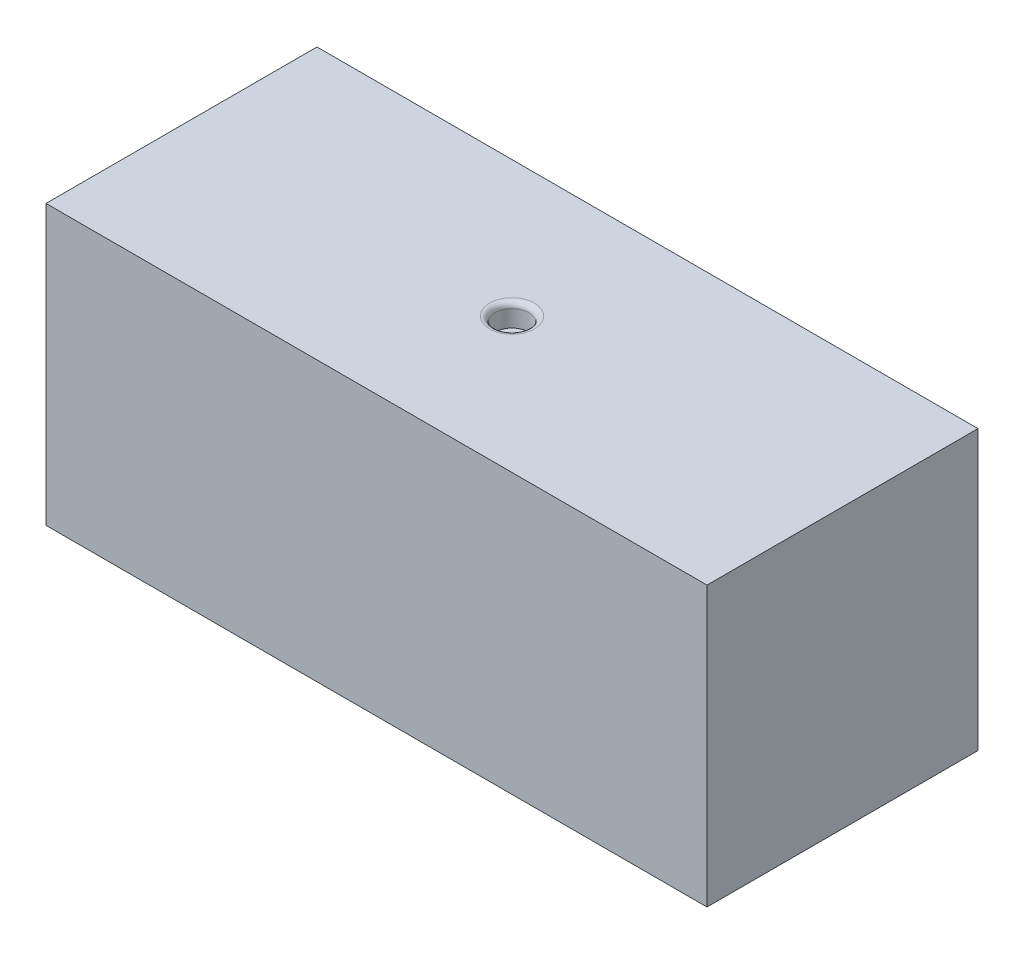
ISO-10303-21;
HEADER;
FILE_DESCRIPTION(('STEP AP214'),'2;1');
FILE_NAME('part.step','',(''),(''),'','','');
FILE_SCHEMA(('AUTOMOTIVE_DESIGN { 1 0 10303 214 1 1 1 1 }'));
ENDSEC;
DATA;
#1=APPLICATION_CONTEXT('core data for automotive mechanical design processes');
#2=APPLICATION_PROTOCOL_DEFINITION('international standard','automotive_design',2000,#1);
#3=PRODUCT_CONTEXT('',#1,'mechanical');
#4=PRODUCT('Part','Part','',(#3));
#5=PRODUCT_RELATED_PRODUCT_CATEGORY('part','',(#4));
#6=PRODUCT_DEFINITION_FORMATION('','',#4);
#7=PRODUCT_DEFINITION_CONTEXT('part definition',#1,'design');
#8=PRODUCT_DEFINITION('design','',#6,#7);
#9=PRODUCT_DEFINITION_SHAPE('','',#8);
#10=(LENGTH_UNIT() NAMED_UNIT(*) SI_UNIT(.MILLI.,.METRE.));
#11=(NAMED_UNIT(*) PLANE_ANGLE_UNIT() SI_UNIT($,.RADIAN.));
#12=(NAMED_UNIT(*) SI_UNIT($,.STERADIAN.) SOLID_ANGLE_UNIT());
#13=UNCERTAINTY_MEASURE_WITH_UNIT(LENGTH_MEASURE(1.E-05),#10,'distance_accuracy_value','');
#14=(GEOMETRIC_REPRESENTATION_CONTEXT(3) GLOBAL_UNCERTAINTY_ASSIGNED_CONTEXT((#13)) GLOBAL_UNIT_ASSIGNED_CONTEXT((#10,
#11,#12)) REPRESENTATION_CONTEXT('',''));
#15=CARTESIAN_POINT('',(0.,0.,0.));
#16=DIRECTION('',(0.,0.,1.));
#17=DIRECTION('',(1.,0.,0.));
#18=AXIS2_PLACEMENT_3D('',#15,#16,#17);
#19=CARTESIAN_POINT('',(0.,52.,0.));
#20=DIRECTION('',(0.,1.,0.));
#21=DIRECTION('',(0.,0.,1.));
#22=AXIS2_PLACEMENT_3D('',#19,#20,#21);
#23=PLANE('',#22);
#24=DIRECTION('',(0.,0.,-1.));
#25=VECTOR('',#24,1.);
#26=CARTESIAN_POINT('',(-87.65,52.,35.195));
#27=LINE('',#26,#25);
#28=CARTESIAN_POINT('',(-87.65,52.,35.195));
#29=VERTEX_POINT('',#28);
#30=CARTESIAN_POINT('',(-87.65,52.,-35.195));
#31=VERTEX_POINT('',#30);
#32=EDGE_CURVE('E367',#29,#31,#27,.T.);
#33=ORIENTED_EDGE('',*,*,#32,.F.);
#34=DIRECTION('',(-1.,0.,0.));
#35=VECTOR('',#34,1.);
#36=CARTESIAN_POINT('',(87.6499999999999,52.,35.195));
#37=LINE('',#36,#35);
#38=CARTESIAN_POINT('',(87.6499999999999,52.,35.195));
#39=VERTEX_POINT('',#38);
#40=EDGE_CURVE('E51',#39,#29,#37,.T.);
#41=ORIENTED_EDGE('',*,*,#40,.F.);
#42=DIRECTION('',(0.,0.,1.));
#43=VECTOR('',#42,1.);
#44=CARTESIAN_POINT('',(87.6499999999999,52.,-35.195));
#45=LINE('',#44,#43);
#46=CARTESIAN_POINT('',(87.6499999999999,52.,-35.195));
#47=VERTEX_POINT('',#46);
#48=EDGE_CURVE('E360',#47,#39,#45,.T.);
#49=ORIENTED_EDGE('',*,*,#48,.F.);
#50=DIRECTION('',(1.,0.,0.));
#51=VECTOR('',#50,1.);
#52=CARTESIAN_POINT('',(-87.65,52.,-35.195));
#53=LINE('',#52,#51);
#54=EDGE_CURVE('E364',#31,#47,#53,.T.);
#55=ORIENTED_EDGE('',*,*,#54,.F.);
#56=EDGE_LOOP('',(#33,#41,#49,#55));
#57=FACE_BOUND('',#56,.T.);
#58=DIRECTION('',(0.,0.,1.));
#59=VECTOR('',#58,1.);
#60=CARTESIAN_POINT('',(-88.9,52.,36.445));
#61=LINE('',#60,#59);
#62=CARTESIAN_POINT('',(-88.9,52.,-36.445));
#63=VERTEX_POINT('',#62);
#64=CARTESIAN_POINT('',(-88.9,52.,36.445));
#65=VERTEX_POINT('',#64);
#66=EDGE_CURVE('E173',#63,#65,#61,.T.);
#67=ORIENTED_EDGE('',*,*,#66,.F.);
#68=DIRECTION('',(1.,0.,0.));
#69=VECTOR('',#68,1.);
#70=CARTESIAN_POINT('',(0.,52.,-36.445));
#71=LINE('',#70,#69);
#72=CARTESIAN_POINT('',(88.8999999999999,52.,-36.445));
#73=VERTEX_POINT('',#72);
#74=EDGE_CURVE('E195',#63,#73,#71,.T.);
#75=ORIENTED_EDGE('',*,*,#74,.T.);
#76=DIRECTION('',(0.,0.,-1.));
#77=VECTOR('',#76,1.);
#78=CARTESIAN_POINT('',(88.8999999999999,52.,36.445));
#79=LINE('',#78,#77);
#80=CARTESIAN_POINT('',(88.8999999999999,52.,36.445));
#81=VERTEX_POINT('',#80);
#82=EDGE_CURVE('E198',#81,#73,#79,.T.);
#83=ORIENTED_EDGE('',*,*,#82,.F.);
#84=DIRECTION('',(1.,0.,0.));
#85=VECTOR('',#84,1.);
#86=CARTESIAN_POINT('',(0.,52.,36.445));
#87=LINE('',#86,#85);
#88=EDGE_CURVE('E170',#65,#81,#87,.T.);
#89=ORIENTED_EDGE('',*,*,#88,.F.);
#90=EDGE_LOOP('',(#67,#75,#83,#89));
#91=FACE_BOUND('',#90,.T.);
#92=ADVANCED_FACE('F36',(#57,#91),#23,.F.);
#93=CARTESIAN_POINT('',(88.8999999999999,-127.,36.445));
#94=DIRECTION('',(-1.,0.,0.));
#95=DIRECTION('',(0.,0.,1.));
#96=AXIS2_PLACEMENT_3D('',#93,#94,#95);
#97=PLANE('',#96);
#98=DIRECTION('',(0.,1.,0.));
#99=VECTOR('',#98,1.);
#100=CARTESIAN_POINT('',(88.8999999999999,-127.,36.445));
#101=LINE('',#100,#99);
#102=CARTESIAN_POINT('',(88.8999999999999,127.,36.445));
#103=VERTEX_POINT('',#102);
#104=EDGE_CURVE('E308',#81,#103,#101,.T.);
#105=ORIENTED_EDGE('',*,*,#104,.F.);
#106=ORIENTED_EDGE('',*,*,#82,.T.);
#107=DIRECTION('',(0.,1.,0.));
#108=VECTOR('',#107,1.);
#109=CARTESIAN_POINT('',(88.8999999999999,-127.,-36.445));
#110=LINE('',#109,#108);
#111=CARTESIAN_POINT('',(88.8999999999999,127.,-36.445));
#112=VERTEX_POINT('',#111);
#113=EDGE_CURVE('E302',#73,#112,#110,.T.);
#114=ORIENTED_EDGE('',*,*,#113,.T.);
#115=DIRECTION('',(0.,0.,-1.));
#116=VECTOR('',#115,1.);
#117=CARTESIAN_POINT('',(88.8999999999999,127.,36.445));
#118=LINE('',#117,#116);
#119=EDGE_CURVE('E179',#103,#112,#118,.T.);
#120=ORIENTED_EDGE('',*,*,#119,.F.);
#121=EDGE_LOOP('',(#105,#106,#114,#120));
#122=FACE_BOUND('',#121,.T.);
#123=ADVANCED_FACE('F216',(#122),#97,.F.);
#124=CARTESIAN_POINT('',(-88.9,127.,36.445));
#125=DIRECTION('',(0.,-1.,0.));
#126=DIRECTION('',(0.,0.,-1.));
#127=AXIS2_PLACEMENT_3D('',#124,#125,#126);
#128=PLANE('',#127);
#129=CARTESIAN_POINT('',(0.,127.,0.));
#130=DIRECTION('',(0.,-1.,0.));
#131=DIRECTION('',(0.,0.,-1.));
#132=AXIS2_PLACEMENT_3D('',#129,#130,#131);
#133=CIRCLE('',#132,6.025);
#134=CARTESIAN_POINT('',(0.,127.,-6.025));
#135=VERTEX_POINT('',#134);
#136=EDGE_CURVE('E12',#135,#135,#133,.T.);
#137=ORIENTED_EDGE('',*,*,#136,.T.);
#138=EDGE_LOOP('',(#137));
#139=FACE_BOUND('',#138,.T.);
#140=DIRECTION('',(-1.,0.,0.));
#141=VECTOR('',#140,1.);
#142=CARTESIAN_POINT('',(-88.9,127.,-36.445));
#143=LINE('',#142,#141);
#144=CARTESIAN_POINT('',(-88.9,127.,-36.445));
#145=VERTEX_POINT('',#144);
#146=EDGE_CURVE('E318',#112,#145,#143,.T.);
#147=ORIENTED_EDGE('',*,*,#146,.T.);
#148=DIRECTION('',(0.,0.,-1.));
#149=VECTOR('',#148,1.);
#150=CARTESIAN_POINT('',(-88.9,127.,36.445));
#151=LINE('',#150,#149);
#152=CARTESIAN_POINT('',(-88.9,127.,36.445));
#153=VERTEX_POINT('',#152);
#154=EDGE_CURVE('E316',#153,#145,#151,.T.);
#155=ORIENTED_EDGE('',*,*,#154,.F.);
#156=DIRECTION('',(-1.,0.,0.));
#157=VECTOR('',#156,1.);
#158=CARTESIAN_POINT('',(-88.9,127.,36.445));
#159=LINE('',#158,#157);
#160=EDGE_CURVE('E310',#103,#153,#159,.T.);
#161=ORIENTED_EDGE('',*,*,#160,.F.);
#162=ORIENTED_EDGE('',*,*,#119,.T.);
#163=EDGE_LOOP('',(#147,#155,#161,#162));
#164=FACE_BOUND('',#163,.T.);
#165=ADVANCED_FACE('F222',(#139,#164),#128,.F.);
#166=CARTESIAN_POINT('',(-88.9,-127.,36.445));
#167=DIRECTION('',(1.,0.,0.));
#168=DIRECTION('',(0.,0.,-1.));
#169=AXIS2_PLACEMENT_3D('',#166,#167,#168);
#170=PLANE('',#169);
#171=DIRECTION('',(0.,-1.,0.));
#172=VECTOR('',#171,1.);
#173=CARTESIAN_POINT('',(-88.9,-127.,-36.445));
#174=LINE('',#173,#172);
#175=EDGE_CURVE('E311',#145,#63,#174,.T.);
#176=ORIENTED_EDGE('',*,*,#175,.T.);
#177=ORIENTED_EDGE('',*,*,#66,.T.);
#178=DIRECTION('',(0.,-1.,0.));
#179=VECTOR('',#178,1.);
#180=CARTESIAN_POINT('',(-88.9,-127.,36.445));
#181=LINE('',#180,#179);
#182=EDGE_CURVE('E313',#153,#65,#181,.T.);
#183=ORIENTED_EDGE('',*,*,#182,.F.);
#184=ORIENTED_EDGE('',*,*,#154,.T.);
#185=EDGE_LOOP('',(#176,#177,#183,#184));
#186=FACE_BOUND('',#185,.T.);
#187=ADVANCED_FACE('F260',(#186),#170,.F.);
#188=CARTESIAN_POINT('',(0.,0.,36.445));
#189=DIRECTION('',(0.,0.,-1.));
#190=DIRECTION('',(-1.,0.,0.));
#191=AXIS2_PLACEMENT_3D('',#188,#189,#190);
#192=PLANE('',#191);
#193=ORIENTED_EDGE('',*,*,#182,.T.);
#194=ORIENTED_EDGE('',*,*,#88,.T.);
#195=ORIENTED_EDGE('',*,*,#104,.T.);
#196=ORIENTED_EDGE('',*,*,#160,.T.);
#197=EDGE_LOOP('',(#193,#194,#195,#196));
#198=FACE_BOUND('',#197,.T.);
#199=ADVANCED_FACE('F257',(#198),#192,.F.);
#200=CARTESIAN_POINT('',(0.,0.,-36.445));
#201=DIRECTION('',(0.,0.,-1.));
#202=DIRECTION('',(-1.,0.,0.));
#203=AXIS2_PLACEMENT_3D('',#200,#201,#202);
#204=PLANE('',#203);
#205=ORIENTED_EDGE('',*,*,#74,.F.);
#206=ORIENTED_EDGE('',*,*,#175,.F.);
#207=ORIENTED_EDGE('',*,*,#146,.F.);
#208=ORIENTED_EDGE('',*,*,#113,.F.);
#209=EDGE_LOOP('',(#205,#206,#207,#208));
#210=FACE_BOUND('',#209,.T.);
#211=ADVANCED_FACE('F239',(#210),#204,.T.);
#212=CARTESIAN_POINT('',(0.,121.,0.));
#213=DIRECTION('',(0.,1.,0.));
#214=DIRECTION('',(0.,0.,1.));
#215=AXIS2_PLACEMENT_3D('',#212,#213,#214);
#216=CYLINDRICAL_SURFACE('',#215,4.525);
#217=CARTESIAN_POINT('',(0.,125.5,0.));
#218=DIRECTION('',(0.,-1.,0.));
#219=DIRECTION('',(0.,0.,-1.));
#220=AXIS2_PLACEMENT_3D('',#217,#218,#219);
#221=CIRCLE('',#220,4.525);
#222=CARTESIAN_POINT('',(0.,125.5,-4.525));
#223=VERTEX_POINT('',#222);
#224=EDGE_CURVE('E44',#223,#223,#221,.F.);
#225=ORIENTED_EDGE('',*,*,#224,.T.);
#226=EDGE_LOOP('',(#225));
#227=FACE_BOUND('',#226,.T.);
#228=CARTESIAN_POINT('',(0.,121.,0.));
#229=DIRECTION('',(0.,1.,0.));
#230=DIRECTION('',(0.,0.,1.));
#231=AXIS2_PLACEMENT_3D('',#228,#229,#230);
#232=CIRCLE('',#231,4.525);
#233=CARTESIAN_POINT('',(0.,121.,4.525));
#234=VERTEX_POINT('',#233);
#235=EDGE_CURVE('E342',#234,#234,#232,.T.);
#236=ORIENTED_EDGE('',*,*,#235,.F.);
#237=EDGE_LOOP('',(#236));
#238=FACE_BOUND('',#237,.T.);
#239=ADVANCED_FACE('F204',(#227,#238),#216,.F.);
#240=CARTESIAN_POINT('',(0.,121.,0.));
#241=DIRECTION('',(0.,1.,0.));
#242=DIRECTION('',(0.,0.,1.));
#243=AXIS2_PLACEMENT_3D('',#240,#241,#242);
#244=PLANE('',#243);
#245=ORIENTED_EDGE('',*,*,#235,.T.);
#246=EDGE_LOOP('',(#245));
#247=FACE_BOUND('',#246,.T.);
#248=ADVANCED_FACE('F218',(#247),#244,.T.);
#249=CARTESIAN_POINT('',(87.6499999999999,77.,35.195));
#250=DIRECTION('',(0.,0.,1.));
#251=DIRECTION('',(1.,0.,0.));
#252=AXIS2_PLACEMENT_3D('',#249,#250,#251);
#253=PLANE('',#252);
#254=ORIENTED_EDGE('',*,*,#40,.T.);
#255=DIRECTION('',(0.,-1.,0.));
#256=VECTOR('',#255,1.);
#257=CARTESIAN_POINT('',(-87.65,77.,35.195));
#258=LINE('',#257,#256);
#259=CARTESIAN_POINT('',(-87.65,77.,35.195));
#260=VERTEX_POINT('',#259);
#261=EDGE_CURVE('E352',#260,#29,#258,.T.);
#262=ORIENTED_EDGE('',*,*,#261,.F.);
#263=DIRECTION('',(-1.,0.,0.));
#264=VECTOR('',#263,1.);
#265=CARTESIAN_POINT('',(87.6499999999999,77.,35.195));
#266=LINE('',#265,#264);
#267=CARTESIAN_POINT('',(87.6499999999999,77.,35.195));
#268=VERTEX_POINT('',#267);
#269=EDGE_CURVE('E363',#268,#260,#266,.T.);
#270=ORIENTED_EDGE('',*,*,#269,.F.);
#271=DIRECTION('',(0.,-1.,0.));
#272=VECTOR('',#271,1.);
#273=CARTESIAN_POINT('',(87.6499999999999,77.,35.195));
#274=LINE('',#273,#272);
#275=EDGE_CURVE('E351',#268,#39,#274,.T.);
#276=ORIENTED_EDGE('',*,*,#275,.T.);
#277=EDGE_LOOP('',(#254,#262,#270,#276));
#278=FACE_BOUND('',#277,.T.);
#279=ADVANCED_FACE('F225',(#278),#253,.F.);
#280=CARTESIAN_POINT('',(87.6499999999999,77.,-35.195));
#281=DIRECTION('',(1.,0.,0.));
#282=DIRECTION('',(0.,0.,-1.));
#283=AXIS2_PLACEMENT_3D('',#280,#281,#282);
#284=PLANE('',#283);
#285=ORIENTED_EDGE('',*,*,#48,.T.);
#286=ORIENTED_EDGE('',*,*,#275,.F.);
#287=DIRECTION('',(0.,0.,1.));
#288=VECTOR('',#287,1.);
#289=CARTESIAN_POINT('',(87.6499999999999,77.,-35.195));
#290=LINE('',#289,#288);
#291=CARTESIAN_POINT('',(87.6499999999999,77.,-35.195));
#292=VERTEX_POINT('',#291);
#293=EDGE_CURVE('E355',#292,#268,#290,.T.);
#294=ORIENTED_EDGE('',*,*,#293,.F.);
#295=DIRECTION('',(0.,-1.,0.));
#296=VECTOR('',#295,1.);
#297=CARTESIAN_POINT('',(87.6499999999999,77.,-35.195));
#298=LINE('',#297,#296);
#299=EDGE_CURVE('E357',#292,#47,#298,.T.);
#300=ORIENTED_EDGE('',*,*,#299,.T.);
#301=EDGE_LOOP('',(#285,#286,#294,#300));
#302=FACE_BOUND('',#301,.T.);
#303=ADVANCED_FACE('F236',(#302),#284,.F.);
#304=CARTESIAN_POINT('',(-87.65,77.,-35.195));
#305=DIRECTION('',(0.,0.,-1.));
#306=DIRECTION('',(-1.,0.,0.));
#307=AXIS2_PLACEMENT_3D('',#304,#305,#306);
#308=PLANE('',#307);
#309=ORIENTED_EDGE('',*,*,#54,.T.);
#310=ORIENTED_EDGE('',*,*,#299,.F.);
#311=DIRECTION('',(1.,0.,0.));
#312=VECTOR('',#311,1.);
#313=CARTESIAN_POINT('',(-87.65,77.,-35.195));
#314=LINE('',#313,#312);
#315=CARTESIAN_POINT('',(-87.65,77.,-35.195));
#316=VERTEX_POINT('',#315);
#317=EDGE_CURVE('E373',#316,#292,#314,.T.);
#318=ORIENTED_EDGE('',*,*,#317,.F.);
#319=DIRECTION('',(0.,-1.,0.));
#320=VECTOR('',#319,1.);
#321=CARTESIAN_POINT('',(-87.65,77.,-35.195));
#322=LINE('',#321,#320);
#323=EDGE_CURVE('E354',#316,#31,#322,.T.);
#324=ORIENTED_EDGE('',*,*,#323,.T.);
#325=EDGE_LOOP('',(#309,#310,#318,#324));
#326=FACE_BOUND('',#325,.T.);
#327=ADVANCED_FACE('F389',(#326),#308,.F.);
#328=CARTESIAN_POINT('',(-87.65,77.,35.195));
#329=DIRECTION('',(-1.,0.,0.));
#330=DIRECTION('',(0.,0.,1.));
#331=AXIS2_PLACEMENT_3D('',#328,#329,#330);
#332=PLANE('',#331);
#333=ORIENTED_EDGE('',*,*,#32,.T.);
#334=ORIENTED_EDGE('',*,*,#323,.F.);
#335=DIRECTION('',(0.,0.,-1.));
#336=VECTOR('',#335,1.);
#337=CARTESIAN_POINT('',(-87.65,77.,35.195));
#338=LINE('',#337,#336);
#339=EDGE_CURVE('E376',#260,#316,#338,.T.);
#340=ORIENTED_EDGE('',*,*,#339,.F.);
#341=ORIENTED_EDGE('',*,*,#261,.T.);
#342=EDGE_LOOP('',(#333,#334,#340,#341));
#343=FACE_BOUND('',#342,.T.);
#344=ADVANCED_FACE('F385',(#343),#332,.F.);
#345=CARTESIAN_POINT('',(0.,77.,0.));
#346=DIRECTION('',(0.,-1.,0.));
#347=DIRECTION('',(0.,0.,-1.));
#348=AXIS2_PLACEMENT_3D('',#345,#346,#347);
#349=PLANE('',#348);
#350=DIRECTION('',(0.,0.,1.));
#351=VECTOR('',#350,1.);
#352=CARTESIAN_POINT('',(85.8999999999999,77.,-33.445));
#353=LINE('',#352,#351);
#354=CARTESIAN_POINT('',(85.8999999999999,77.,-33.445));
#355=VERTEX_POINT('',#354);
#356=CARTESIAN_POINT('',(85.8999999999999,77.,33.445));
#357=VERTEX_POINT('',#356);
#358=EDGE_CURVE('E286',#355,#357,#353,.T.);
#359=ORIENTED_EDGE('',*,*,#358,.F.);
#360=DIRECTION('',(1.,0.,0.));
#361=VECTOR('',#360,1.);
#362=CARTESIAN_POINT('',(-85.9,77.,-33.445));
#363=LINE('',#362,#361);
#364=CARTESIAN_POINT('',(-85.9,77.,-33.445));
#365=VERTEX_POINT('',#364);
#366=EDGE_CURVE('E151',#365,#355,#363,.T.);
#367=ORIENTED_EDGE('',*,*,#366,.F.);
#368=DIRECTION('',(0.,0.,-1.));
#369=VECTOR('',#368,1.);
#370=CARTESIAN_POINT('',(-85.9,77.,33.445));
#371=LINE('',#370,#369);
#372=CARTESIAN_POINT('',(-85.9,77.,33.445));
#373=VERTEX_POINT('',#372);
#374=EDGE_CURVE('E147',#373,#365,#371,.T.);
#375=ORIENTED_EDGE('',*,*,#374,.F.);
#376=DIRECTION('',(-1.,0.,0.));
#377=VECTOR('',#376,1.);
#378=CARTESIAN_POINT('',(85.8999999999999,77.,33.445));
#379=LINE('',#378,#377);
#380=EDGE_CURVE('E59',#357,#373,#379,.T.);
#381=ORIENTED_EDGE('',*,*,#380,.F.);
#382=EDGE_LOOP('',(#359,#367,#375,#381));
#383=FACE_BOUND('',#382,.T.);
#384=ORIENTED_EDGE('',*,*,#269,.T.);
#385=ORIENTED_EDGE('',*,*,#339,.T.);
#386=ORIENTED_EDGE('',*,*,#317,.T.);
#387=ORIENTED_EDGE('',*,*,#293,.T.);
#388=EDGE_LOOP('',(#384,#385,#386,#387));
#389=FACE_BOUND('',#388,.T.);
#390=ADVANCED_FACE('F148',(#383,#389),#349,.T.);
#391=CARTESIAN_POINT('',(-6.,118.,33.445));
#392=DIRECTION('',(1.,0.,0.));
#393=DIRECTION('',(0.,0.,-1.));
#394=AXIS2_PLACEMENT_3D('',#391,#392,#393);
#395=PLANE('',#394);
#396=DIRECTION('',(0.,0.,-1.));
#397=VECTOR('',#396,1.);
#398=CARTESIAN_POINT('',(-6.,124.,33.445));
#399=LINE('',#398,#397);
#400=CARTESIAN_POINT('',(-6.,124.,33.445));
#401=VERTEX_POINT('',#400);
#402=CARTESIAN_POINT('',(-6.,124.,-33.445));
#403=VERTEX_POINT('',#402);
#404=EDGE_CURVE('E339',#401,#403,#399,.T.);
#405=ORIENTED_EDGE('',*,*,#404,.T.);
#406=DIRECTION('',(0.,1.,0.));
#407=VECTOR('',#406,1.);
#408=CARTESIAN_POINT('',(-6.,118.,-33.445));
#409=LINE('',#408,#407);
#410=CARTESIAN_POINT('',(-6.,118.,-33.445));
#411=VERTEX_POINT('',#410);
#412=EDGE_CURVE('E299',#411,#403,#409,.T.);
#413=ORIENTED_EDGE('',*,*,#412,.F.);
#414=DIRECTION('',(0.,0.,-1.));
#415=VECTOR('',#414,1.);
#416=CARTESIAN_POINT('',(-6.,118.,33.445));
#417=LINE('',#416,#415);
#418=CARTESIAN_POINT('',(-6.,118.,33.445));
#419=VERTEX_POINT('',#418);
#420=EDGE_CURVE('E338',#419,#411,#417,.T.);
#421=ORIENTED_EDGE('',*,*,#420,.F.);
#422=DIRECTION('',(0.,1.,0.));
#423=VECTOR('',#422,1.);
#424=CARTESIAN_POINT('',(-6.,118.,33.445));
#425=LINE('',#424,#423);
#426=EDGE_CURVE('E304',#419,#401,#425,.T.);
#427=ORIENTED_EDGE('',*,*,#426,.T.);
#428=EDGE_LOOP('',(#405,#413,#421,#427));
#429=FACE_BOUND('',#428,.T.);
#430=ADVANCED_FACE('F248',(#429),#395,.F.);
#431=CARTESIAN_POINT('',(0.,118.,0.));
#432=DIRECTION('',(0.,1.,0.));
#433=DIRECTION('',(0.,0.,1.));
#434=AXIS2_PLACEMENT_3D('',#431,#432,#433);
#435=PLANE('',#434);
#436=ORIENTED_EDGE('',*,*,#420,.T.);
#437=DIRECTION('',(1.,0.,0.));
#438=VECTOR('',#437,1.);
#439=CARTESIAN_POINT('',(6.,118.,-33.445));
#440=LINE('',#439,#438);
#441=CARTESIAN_POINT('',(6.,118.,-33.445));
#442=VERTEX_POINT('',#441);
#443=EDGE_CURVE('E346',#411,#442,#440,.T.);
#444=ORIENTED_EDGE('',*,*,#443,.T.);
#445=DIRECTION('',(0.,0.,1.));
#446=VECTOR('',#445,1.);
#447=CARTESIAN_POINT('',(6.,118.,33.445));
#448=LINE('',#447,#446);
#449=CARTESIAN_POINT('',(6.,118.,33.445));
#450=VERTEX_POINT('',#449);
#451=EDGE_CURVE('E298',#442,#450,#448,.T.);
#452=ORIENTED_EDGE('',*,*,#451,.T.);
#453=DIRECTION('',(-1.,0.,0.));
#454=VECTOR('',#453,1.);
#455=CARTESIAN_POINT('',(6.,118.,33.445));
#456=LINE('',#455,#454);
#457=EDGE_CURVE('E336',#450,#419,#456,.T.);
#458=ORIENTED_EDGE('',*,*,#457,.T.);
#459=EDGE_LOOP('',(#436,#444,#452,#458));
#460=FACE_BOUND('',#459,.T.);
#461=ADVANCED_FACE('F244',(#460),#435,.F.);
#462=CARTESIAN_POINT('',(6.,118.,33.445));
#463=DIRECTION('',(-1.,0.,0.));
#464=DIRECTION('',(0.,0.,1.));
#465=AXIS2_PLACEMENT_3D('',#462,#463,#464);
#466=PLANE('',#465);
#467=DIRECTION('',(0.,0.,1.));
#468=VECTOR('',#467,1.);
#469=CARTESIAN_POINT('',(6.,124.,33.445));
#470=LINE('',#469,#468);
#471=CARTESIAN_POINT('',(6.,124.,-33.445));
#472=VERTEX_POINT('',#471);
#473=CARTESIAN_POINT('',(6.,124.,33.445));
#474=VERTEX_POINT('',#473);
#475=EDGE_CURVE('E291',#472,#474,#470,.T.);
#476=ORIENTED_EDGE('',*,*,#475,.T.);
#477=DIRECTION('',(0.,1.,0.));
#478=VECTOR('',#477,1.);
#479=CARTESIAN_POINT('',(6.,118.,33.445));
#480=LINE('',#479,#478);
#481=EDGE_CURVE('E300',#450,#474,#480,.T.);
#482=ORIENTED_EDGE('',*,*,#481,.F.);
#483=ORIENTED_EDGE('',*,*,#451,.F.);
#484=DIRECTION('',(0.,1.,0.));
#485=VECTOR('',#484,1.);
#486=CARTESIAN_POINT('',(6.,118.,-33.445));
#487=LINE('',#486,#485);
#488=EDGE_CURVE('E293',#442,#472,#487,.T.);
#489=ORIENTED_EDGE('',*,*,#488,.T.);
#490=EDGE_LOOP('',(#476,#482,#483,#489));
#491=FACE_BOUND('',#490,.T.);
#492=ADVANCED_FACE('F247',(#491),#466,.F.);
#493=CARTESIAN_POINT('',(-88.9,124.,36.445));
#494=DIRECTION('',(0.,-1.,0.));
#495=DIRECTION('',(0.,0.,-1.));
#496=AXIS2_PLACEMENT_3D('',#493,#494,#495);
#497=PLANE('',#496);
#498=DIRECTION('',(-1.,0.,0.));
#499=VECTOR('',#498,1.);
#500=CARTESIAN_POINT('',(0.,124.,-33.445));
#501=LINE('',#500,#499);
#502=CARTESIAN_POINT('',(-85.9,124.,-33.445));
#503=VERTEX_POINT('',#502);
#504=EDGE_CURVE('E192',#403,#503,#501,.T.);
#505=ORIENTED_EDGE('',*,*,#504,.F.);
#506=ORIENTED_EDGE('',*,*,#404,.F.);
#507=DIRECTION('',(-1.,0.,0.));
#508=VECTOR('',#507,1.);
#509=CARTESIAN_POINT('',(0.,124.,33.445));
#510=LINE('',#509,#508);
#511=CARTESIAN_POINT('',(-85.9,124.,33.445));
#512=VERTEX_POINT('',#511);
#513=EDGE_CURVE('E176',#401,#512,#510,.T.);
#514=ORIENTED_EDGE('',*,*,#513,.T.);
#515=DIRECTION('',(0.,0.,-1.));
#516=VECTOR('',#515,1.);
#517=CARTESIAN_POINT('',(-85.9,124.,36.445));
#518=LINE('',#517,#516);
#519=EDGE_CURVE('E169',#512,#503,#518,.T.);
#520=ORIENTED_EDGE('',*,*,#519,.T.);
#521=EDGE_LOOP('',(#505,#506,#514,#520));
#522=FACE_BOUND('',#521,.T.);
#523=ADVANCED_FACE('F252',(#522),#497,.T.);
#524=CARTESIAN_POINT('',(85.8999999999999,124.,33.445));
#525=VERTEX_POINT('',#524);
#526=EDGE_CURVE('E171',#525,#474,#510,.T.);
#527=ORIENTED_EDGE('',*,*,#526,.T.);
#528=ORIENTED_EDGE('',*,*,#475,.F.);
#529=CARTESIAN_POINT('',(85.8999999999999,124.,-33.445));
#530=VERTEX_POINT('',#529);
#531=EDGE_CURVE('E189',#530,#472,#501,.T.);
#532=ORIENTED_EDGE('',*,*,#531,.F.);
#533=DIRECTION('',(0.,0.,-1.));
#534=VECTOR('',#533,1.);
#535=CARTESIAN_POINT('',(85.8999999999999,124.,36.445));
#536=LINE('',#535,#534);
#537=EDGE_CURVE('E186',#525,#530,#536,.T.);
#538=ORIENTED_EDGE('',*,*,#537,.F.);
#539=EDGE_LOOP('',(#527,#528,#532,#538));
#540=FACE_BOUND('',#539,.T.);
#541=ADVANCED_FACE('F277',(#540),#497,.T.);
#542=CARTESIAN_POINT('',(-85.9,-127.,36.445));
#543=DIRECTION('',(1.,0.,0.));
#544=DIRECTION('',(0.,0.,-1.));
#545=AXIS2_PLACEMENT_3D('',#542,#543,#544);
#546=PLANE('',#545);
#547=DIRECTION('',(0.,-1.,0.));
#548=VECTOR('',#547,1.);
#549=CARTESIAN_POINT('',(-85.9,0.,33.445));
#550=LINE('',#549,#548);
#551=EDGE_CURVE('E162',#512,#373,#550,.T.);
#552=ORIENTED_EDGE('',*,*,#551,.T.);
#553=ORIENTED_EDGE('',*,*,#374,.T.);
#554=DIRECTION('',(0.,-1.,0.));
#555=VECTOR('',#554,1.);
#556=CARTESIAN_POINT('',(-85.9,0.,-33.445));
#557=LINE('',#556,#555);
#558=EDGE_CURVE('E184',#503,#365,#557,.T.);
#559=ORIENTED_EDGE('',*,*,#558,.F.);
#560=ORIENTED_EDGE('',*,*,#519,.F.);
#561=EDGE_LOOP('',(#552,#553,#559,#560));
#562=FACE_BOUND('',#561,.T.);
#563=ADVANCED_FACE('F167',(#562),#546,.T.);
#564=CARTESIAN_POINT('',(85.8999999999999,-127.,36.445));
#565=DIRECTION('',(-1.,0.,0.));
#566=DIRECTION('',(0.,0.,1.));
#567=AXIS2_PLACEMENT_3D('',#564,#565,#566);
#568=PLANE('',#567);
#569=DIRECTION('',(0.,1.,0.));
#570=VECTOR('',#569,1.);
#571=CARTESIAN_POINT('',(85.8999999999999,0.,-33.445));
#572=LINE('',#571,#570);
#573=EDGE_CURVE('E193',#355,#530,#572,.T.);
#574=ORIENTED_EDGE('',*,*,#573,.F.);
#575=ORIENTED_EDGE('',*,*,#358,.T.);
#576=DIRECTION('',(0.,1.,0.));
#577=VECTOR('',#576,1.);
#578=CARTESIAN_POINT('',(85.8999999999999,0.,33.445));
#579=LINE('',#578,#577);
#580=EDGE_CURVE('E164',#357,#525,#579,.T.);
#581=ORIENTED_EDGE('',*,*,#580,.T.);
#582=ORIENTED_EDGE('',*,*,#537,.T.);
#583=EDGE_LOOP('',(#574,#575,#581,#582));
#584=FACE_BOUND('',#583,.T.);
#585=ADVANCED_FACE('F271',(#584),#568,.T.);
#586=CARTESIAN_POINT('',(0.,0.,-33.445));
#587=DIRECTION('',(0.,0.,-1.));
#588=DIRECTION('',(-1.,0.,0.));
#589=AXIS2_PLACEMENT_3D('',#586,#587,#588);
#590=PLANE('',#589);
#591=ORIENTED_EDGE('',*,*,#366,.T.);
#592=ORIENTED_EDGE('',*,*,#573,.T.);
#593=ORIENTED_EDGE('',*,*,#531,.T.);
#594=ORIENTED_EDGE('',*,*,#488,.F.);
#595=ORIENTED_EDGE('',*,*,#443,.F.);
#596=ORIENTED_EDGE('',*,*,#412,.T.);
#597=ORIENTED_EDGE('',*,*,#504,.T.);
#598=ORIENTED_EDGE('',*,*,#558,.T.);
#599=EDGE_LOOP('',(#591,#592,#593,#594,#595,#596,#597,#598));
#600=FACE_BOUND('',#599,.T.);
#601=ADVANCED_FACE('F212',(#600),#590,.F.);
#602=CARTESIAN_POINT('',(0.,0.,33.445));
#603=DIRECTION('',(0.,0.,-1.));
#604=DIRECTION('',(-1.,0.,0.));
#605=AXIS2_PLACEMENT_3D('',#602,#603,#604);
#606=PLANE('',#605);
#607=ORIENTED_EDGE('',*,*,#580,.F.);
#608=ORIENTED_EDGE('',*,*,#380,.T.);
#609=ORIENTED_EDGE('',*,*,#551,.F.);
#610=ORIENTED_EDGE('',*,*,#513,.F.);
#611=ORIENTED_EDGE('',*,*,#426,.F.);
#612=ORIENTED_EDGE('',*,*,#457,.F.);
#613=ORIENTED_EDGE('',*,*,#481,.T.);
#614=ORIENTED_EDGE('',*,*,#526,.F.);
#615=EDGE_LOOP('',(#607,#608,#609,#610,#611,#612,#613,#614));
#616=FACE_BOUND('',#615,.T.);
#617=ADVANCED_FACE('F160',(#616),#606,.T.);
#618=CARTESIAN_POINT('',(0.,125.5,0.));
#619=DIRECTION('',(0.,-1.,0.));
#620=DIRECTION('',(0.,0.,-1.));
#621=AXIS2_PLACEMENT_3D('',#618,#619,#620);
#622=TOROIDAL_SURFACE('',#621,6.025,1.5);
#623=ORIENTED_EDGE('',*,*,#136,.F.);
#624=EDGE_LOOP('',(#623));
#625=FACE_BOUND('',#624,.T.);
#626=ORIENTED_EDGE('',*,*,#224,.F.);
#627=EDGE_LOOP('',(#626));
#628=FACE_BOUND('',#627,.T.);
#629=ADVANCED_FACE('F38',(#625,#628),#622,.T.);
#630=CLOSED_SHELL('',(#92,#123,#165,#187,#199,#211,#239,#248,#279,#303,#327,#344,#390,#430,#461,
#492,#523,#541,#563,#585,#601,#617,#629));
#631=MANIFOLD_SOLID_BREP('B2',#630);
#632=ADVANCED_BREP_SHAPE_REPRESENTATION('',(#18,#631),#14);
#633=SHAPE_DEFINITION_REPRESENTATION(#9,#632);
ENDSEC;
END-ISO-10303-21;
